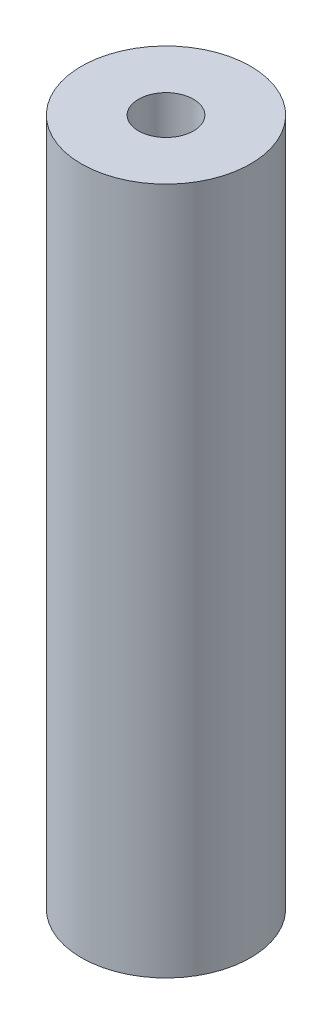
ISO-10303-21;
HEADER;
FILE_DESCRIPTION(('STEP AP214'),'2;1');
FILE_NAME('part.step','',(''),(''),'','','');
FILE_SCHEMA(('AUTOMOTIVE_DESIGN { 1 0 10303 214 1 1 1 1 }'));
ENDSEC;
DATA;
#1=APPLICATION_CONTEXT('core data for automotive mechanical design processes');
#2=APPLICATION_PROTOCOL_DEFINITION('international standard','automotive_design',2000,#1);
#3=PRODUCT_CONTEXT('',#1,'mechanical');
#4=PRODUCT('Part','Part','',(#3));
#5=PRODUCT_RELATED_PRODUCT_CATEGORY('part','',(#4));
#6=PRODUCT_DEFINITION_FORMATION('','',#4);
#7=PRODUCT_DEFINITION_CONTEXT('part definition',#1,'design');
#8=PRODUCT_DEFINITION('design','',#6,#7);
#9=PRODUCT_DEFINITION_SHAPE('','',#8);
#10=(LENGTH_UNIT() NAMED_UNIT(*) SI_UNIT(.MILLI.,.METRE.));
#11=(NAMED_UNIT(*) PLANE_ANGLE_UNIT() SI_UNIT($,.RADIAN.));
#12=(NAMED_UNIT(*) SI_UNIT($,.STERADIAN.) SOLID_ANGLE_UNIT());
#13=UNCERTAINTY_MEASURE_WITH_UNIT(LENGTH_MEASURE(1.E-05),#10,'distance_accuracy_value','');
#14=(GEOMETRIC_REPRESENTATION_CONTEXT(3) GLOBAL_UNCERTAINTY_ASSIGNED_CONTEXT((#13)) GLOBAL_UNIT_ASSIGNED_CONTEXT((#10,
#11,#12)) REPRESENTATION_CONTEXT('',''));
#15=CARTESIAN_POINT('',(0.,0.,0.));
#16=DIRECTION('',(0.,0.,1.));
#17=DIRECTION('',(1.,0.,0.));
#18=AXIS2_PLACEMENT_3D('',#15,#16,#17);
#19=CARTESIAN_POINT('',(0.,32.5,0.));
#20=DIRECTION('',(0.,-1.,0.));
#21=DIRECTION('',(0.,0.,-1.));
#22=AXIS2_PLACEMENT_3D('',#19,#20,#21);
#23=CYLINDRICAL_SURFACE('',#22,4.);
#24=CARTESIAN_POINT('',(0.,32.5,0.));
#25=DIRECTION('',(0.,1.,0.));
#26=DIRECTION('',(0.,0.,1.));
#27=AXIS2_PLACEMENT_3D('',#24,#25,#26);
#28=CIRCLE('',#27,4.);
#29=CARTESIAN_POINT('',(0.,32.5,4.));
#30=VERTEX_POINT('',#29);
#31=EDGE_CURVE('E10',#30,#30,#28,.T.);
#32=ORIENTED_EDGE('',*,*,#31,.F.);
#33=EDGE_LOOP('',(#32));
#34=FACE_BOUND('',#33,.T.);
#35=CARTESIAN_POINT('',(0.,0.,0.));
#36=DIRECTION('',(0.,1.,0.));
#37=DIRECTION('',(0.,0.,1.));
#38=AXIS2_PLACEMENT_3D('',#35,#36,#37);
#39=CIRCLE('',#38,4.);
#40=CARTESIAN_POINT('',(0.,0.,4.));
#41=VERTEX_POINT('',#40);
#42=EDGE_CURVE('E36',#41,#41,#39,.T.);
#43=ORIENTED_EDGE('',*,*,#42,.T.);
#44=EDGE_LOOP('',(#43));
#45=FACE_BOUND('',#44,.T.);
#46=ADVANCED_FACE('F33',(#34,#45),#23,.T.);
#47=CARTESIAN_POINT('',(0.,32.5,0.));
#48=DIRECTION('',(0.,1.,0.));
#49=DIRECTION('',(0.,0.,1.));
#50=AXIS2_PLACEMENT_3D('',#47,#48,#49);
#51=PLANE('',#50);
#52=CARTESIAN_POINT('',(0.,32.5,0.));
#53=DIRECTION('',(0.,1.,0.));
#54=DIRECTION('',(0.,0.,1.));
#55=AXIS2_PLACEMENT_3D('',#52,#53,#54);
#56=CIRCLE('',#55,1.3);
#57=CARTESIAN_POINT('',(0.,32.5,1.3));
#58=VERTEX_POINT('',#57);
#59=EDGE_CURVE('E45',#58,#58,#56,.T.);
#60=ORIENTED_EDGE('',*,*,#59,.F.);
#61=EDGE_LOOP('',(#60));
#62=FACE_BOUND('',#61,.T.);
#63=ORIENTED_EDGE('',*,*,#31,.T.);
#64=EDGE_LOOP('',(#63));
#65=FACE_BOUND('',#64,.T.);
#66=ADVANCED_FACE('F70',(#62,#65),#51,.T.);
#67=CARTESIAN_POINT('',(0.,0.,0.));
#68=DIRECTION('',(0.,1.,0.));
#69=DIRECTION('',(0.,0.,1.));
#70=AXIS2_PLACEMENT_3D('',#67,#68,#69);
#71=PLANE('',#70);
#72=CARTESIAN_POINT('',(0.,0.,0.));
#73=DIRECTION('',(0.,-1.,0.));
#74=DIRECTION('',(0.,0.,-1.));
#75=AXIS2_PLACEMENT_3D('',#72,#73,#74);
#76=CIRCLE('',#75,1.3);
#77=CARTESIAN_POINT('',(0.,0.,-1.3));
#78=VERTEX_POINT('',#77);
#79=EDGE_CURVE('E51',#78,#78,#76,.T.);
#80=ORIENTED_EDGE('',*,*,#79,.F.);
#81=EDGE_LOOP('',(#80));
#82=FACE_BOUND('',#81,.T.);
#83=ORIENTED_EDGE('',*,*,#42,.F.);
#84=EDGE_LOOP('',(#83));
#85=FACE_BOUND('',#84,.T.);
#86=ADVANCED_FACE('F66',(#82,#85),#71,.F.);
#87=CARTESIAN_POINT('',(0.,22.5,0.));
#88=DIRECTION('',(0.,1.,0.));
#89=DIRECTION('',(0.,0.,1.));
#90=AXIS2_PLACEMENT_3D('',#87,#88,#89);
#91=CYLINDRICAL_SURFACE('',#90,1.3);
#92=CARTESIAN_POINT('',(0.,22.5,0.));
#93=DIRECTION('',(0.,1.,0.));
#94=DIRECTION('',(0.,0.,1.));
#95=AXIS2_PLACEMENT_3D('',#92,#93,#94);
#96=CIRCLE('',#95,1.3);
#97=CARTESIAN_POINT('',(0.,22.5,1.3));
#98=VERTEX_POINT('',#97);
#99=EDGE_CURVE('E43',#98,#98,#96,.T.);
#100=ORIENTED_EDGE('',*,*,#99,.F.);
#101=EDGE_LOOP('',(#100));
#102=FACE_BOUND('',#101,.T.);
#103=ORIENTED_EDGE('',*,*,#59,.T.);
#104=EDGE_LOOP('',(#103));
#105=FACE_BOUND('',#104,.T.);
#106=ADVANCED_FACE('F69',(#102,#105),#91,.F.);
#107=CARTESIAN_POINT('',(0.,22.5,0.));
#108=DIRECTION('',(0.,1.,0.));
#109=DIRECTION('',(0.,0.,1.));
#110=AXIS2_PLACEMENT_3D('',#107,#108,#109);
#111=PLANE('',#110);
#112=ORIENTED_EDGE('',*,*,#99,.T.);
#113=EDGE_LOOP('',(#112));
#114=FACE_BOUND('',#113,.T.);
#115=ADVANCED_FACE('F62',(#114),#111,.T.);
#116=CARTESIAN_POINT('',(0.,12.,0.));
#117=DIRECTION('',(0.,-1.,0.));
#118=DIRECTION('',(0.,0.,-1.));
#119=AXIS2_PLACEMENT_3D('',#116,#117,#118);
#120=CYLINDRICAL_SURFACE('',#119,1.3);
#121=CARTESIAN_POINT('',(0.,12.,0.));
#122=DIRECTION('',(0.,-1.,0.));
#123=DIRECTION('',(0.,0.,-1.));
#124=AXIS2_PLACEMENT_3D('',#121,#122,#123);
#125=CIRCLE('',#124,1.3);
#126=CARTESIAN_POINT('',(0.,12.,-1.3));
#127=VERTEX_POINT('',#126);
#128=EDGE_CURVE('E48',#127,#127,#125,.T.);
#129=ORIENTED_EDGE('',*,*,#128,.F.);
#130=EDGE_LOOP('',(#129));
#131=FACE_BOUND('',#130,.T.);
#132=ORIENTED_EDGE('',*,*,#79,.T.);
#133=EDGE_LOOP('',(#132));
#134=FACE_BOUND('',#133,.T.);
#135=ADVANCED_FACE('F59',(#131,#134),#120,.F.);
#136=CARTESIAN_POINT('',(0.,12.,0.));
#137=DIRECTION('',(0.,-1.,0.));
#138=DIRECTION('',(0.,0.,-1.));
#139=AXIS2_PLACEMENT_3D('',#136,#137,#138);
#140=PLANE('',#139);
#141=ORIENTED_EDGE('',*,*,#128,.T.);
#142=EDGE_LOOP('',(#141));
#143=FACE_BOUND('',#142,.T.);
#144=ADVANCED_FACE('F57',(#143),#140,.T.);
#145=CLOSED_SHELL('',(#46,#66,#86,#106,#115,#135,#144));
#146=MANIFOLD_SOLID_BREP('B2',#145);
#147=ADVANCED_BREP_SHAPE_REPRESENTATION('',(#18,#146),#14);
#148=SHAPE_DEFINITION_REPRESENTATION(#9,#147);
ENDSEC;
END-ISO-10303-21;
